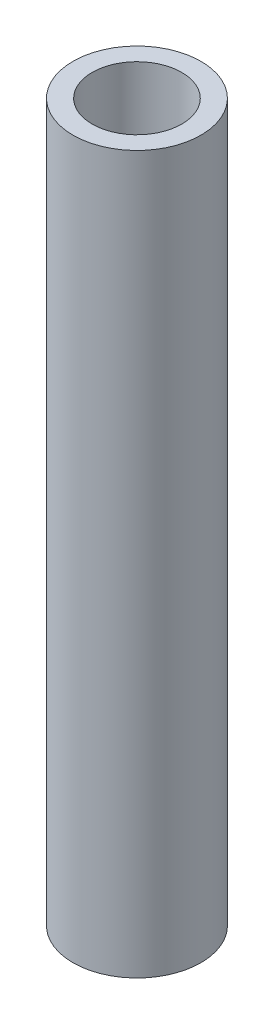
ISO-10303-21;
HEADER;
FILE_DESCRIPTION(('STEP AP214'),'2;1');
FILE_NAME('part.step','',(''),(''),'','','');
FILE_SCHEMA(('AUTOMOTIVE_DESIGN { 1 0 10303 214 1 1 1 1 }'));
ENDSEC;
DATA;
#1=APPLICATION_CONTEXT('core data for automotive mechanical design processes');
#2=APPLICATION_PROTOCOL_DEFINITION('international standard','automotive_design',2000,#1);
#3=PRODUCT_CONTEXT('',#1,'mechanical');
#4=PRODUCT('Part','Part','',(#3));
#5=PRODUCT_RELATED_PRODUCT_CATEGORY('part','',(#4));
#6=PRODUCT_DEFINITION_FORMATION('','',#4);
#7=PRODUCT_DEFINITION_CONTEXT('part definition',#1,'design');
#8=PRODUCT_DEFINITION('design','',#6,#7);
#9=PRODUCT_DEFINITION_SHAPE('','',#8);
#10=(LENGTH_UNIT() NAMED_UNIT(*) SI_UNIT(.MILLI.,.METRE.));
#11=(NAMED_UNIT(*) PLANE_ANGLE_UNIT() SI_UNIT($,.RADIAN.));
#12=(NAMED_UNIT(*) SI_UNIT($,.STERADIAN.) SOLID_ANGLE_UNIT());
#13=UNCERTAINTY_MEASURE_WITH_UNIT(LENGTH_MEASURE(1.E-05),#10,'distance_accuracy_value','');
#14=(GEOMETRIC_REPRESENTATION_CONTEXT(3) GLOBAL_UNCERTAINTY_ASSIGNED_CONTEXT((#13)) GLOBAL_UNIT_ASSIGNED_CONTEXT((#10,
#11,#12)) REPRESENTATION_CONTEXT('',''));
#15=CARTESIAN_POINT('',(0.,0.,0.));
#16=DIRECTION('',(0.,0.,1.));
#17=DIRECTION('',(1.,0.,0.));
#18=AXIS2_PLACEMENT_3D('',#15,#16,#17);
#19=CARTESIAN_POINT('',(-1.44584272608238,28.,-0.184306800515426));
#20=DIRECTION('',(0.,1.,0.));
#21=DIRECTION('',(0.,0.,1.));
#22=AXIS2_PLACEMENT_3D('',#19,#20,#21);
#23=PLANE('',#22);
#24=CARTESIAN_POINT('',(-1.44584272608238,28.,-0.184306800515426));
#25=DIRECTION('',(0.,1.,0.));
#26=DIRECTION('',(0.,0.,1.));
#27=AXIS2_PLACEMENT_3D('',#24,#25,#26);
#28=CIRCLE('',#27,2.5);
#29=CARTESIAN_POINT('',(-1.44584272608238,28.,2.31569319948457));
#30=VERTEX_POINT('',#29);
#31=EDGE_CURVE('E10',#30,#30,#28,.T.);
#32=ORIENTED_EDGE('',*,*,#31,.T.);
#33=EDGE_LOOP('',(#32));
#34=FACE_BOUND('',#33,.T.);
#35=CARTESIAN_POINT('',(-1.44584272608238,28.,-0.184306800515426));
#36=DIRECTION('',(0.,1.,0.));
#37=DIRECTION('',(0.,0.,1.));
#38=AXIS2_PLACEMENT_3D('',#35,#36,#37);
#39=CIRCLE('',#38,1.75);
#40=CARTESIAN_POINT('',(-1.44584272608238,28.,1.56569319948457));
#41=VERTEX_POINT('',#40);
#42=EDGE_CURVE('E42',#41,#41,#39,.T.);
#43=ORIENTED_EDGE('',*,*,#42,.F.);
#44=EDGE_LOOP('',(#43));
#45=FACE_BOUND('',#44,.T.);
#46=ADVANCED_FACE('F31',(#34,#45),#23,.T.);
#47=CARTESIAN_POINT('',(-1.44584272608238,0.,-0.184306800515426));
#48=DIRECTION('',(0.,1.,0.));
#49=DIRECTION('',(0.,0.,1.));
#50=AXIS2_PLACEMENT_3D('',#47,#48,#49);
#51=PLANE('',#50);
#52=CARTESIAN_POINT('',(-1.44584272608238,0.,-0.184306800515426));
#53=DIRECTION('',(0.,1.,0.));
#54=DIRECTION('',(0.,0.,1.));
#55=AXIS2_PLACEMENT_3D('',#52,#53,#54);
#56=CIRCLE('',#55,2.5);
#57=CARTESIAN_POINT('',(-1.44584272608238,0.,2.31569319948457));
#58=VERTEX_POINT('',#57);
#59=EDGE_CURVE('E35',#58,#58,#56,.T.);
#60=ORIENTED_EDGE('',*,*,#59,.F.);
#61=EDGE_LOOP('',(#60));
#62=FACE_BOUND('',#61,.T.);
#63=CARTESIAN_POINT('',(-1.44584272608238,0.,-0.184306800515426));
#64=DIRECTION('',(0.,1.,0.));
#65=DIRECTION('',(0.,0.,1.));
#66=AXIS2_PLACEMENT_3D('',#63,#64,#65);
#67=CIRCLE('',#66,1.75);
#68=CARTESIAN_POINT('',(-1.44584272608238,0.,1.56569319948457));
#69=VERTEX_POINT('',#68);
#70=EDGE_CURVE('E44',#69,#69,#67,.T.);
#71=ORIENTED_EDGE('',*,*,#70,.T.);
#72=EDGE_LOOP('',(#71));
#73=FACE_BOUND('',#72,.T.);
#74=ADVANCED_FACE('F54',(#62,#73),#51,.F.);
#75=CARTESIAN_POINT('',(-1.44584272608238,28.,-0.184306800515426));
#76=DIRECTION('',(0.,-1.,0.));
#77=DIRECTION('',(0.,0.,-1.));
#78=AXIS2_PLACEMENT_3D('',#75,#76,#77);
#79=CYLINDRICAL_SURFACE('',#78,2.5);
#80=ORIENTED_EDGE('',*,*,#31,.F.);
#81=EDGE_LOOP('',(#80));
#82=FACE_BOUND('',#81,.T.);
#83=ORIENTED_EDGE('',*,*,#59,.T.);
#84=EDGE_LOOP('',(#83));
#85=FACE_BOUND('',#84,.T.);
#86=ADVANCED_FACE('F33',(#82,#85),#79,.T.);
#87=CARTESIAN_POINT('',(-1.44584272608238,28.,-0.184306800515426));
#88=DIRECTION('',(0.,-1.,0.));
#89=DIRECTION('',(0.,0.,-1.));
#90=AXIS2_PLACEMENT_3D('',#87,#88,#89);
#91=CYLINDRICAL_SURFACE('',#90,1.75);
#92=ORIENTED_EDGE('',*,*,#42,.T.);
#93=EDGE_LOOP('',(#92));
#94=FACE_BOUND('',#93,.T.);
#95=ORIENTED_EDGE('',*,*,#70,.F.);
#96=EDGE_LOOP('',(#95));
#97=FACE_BOUND('',#96,.T.);
#98=ADVANCED_FACE('F50',(#94,#97),#91,.F.);
#99=CLOSED_SHELL('',(#46,#74,#86,#98));
#100=MANIFOLD_SOLID_BREP('B2',#99);
#101=ADVANCED_BREP_SHAPE_REPRESENTATION('',(#18,#100),#14);
#102=SHAPE_DEFINITION_REPRESENTATION(#9,#101);
ENDSEC;
END-ISO-10303-21;
